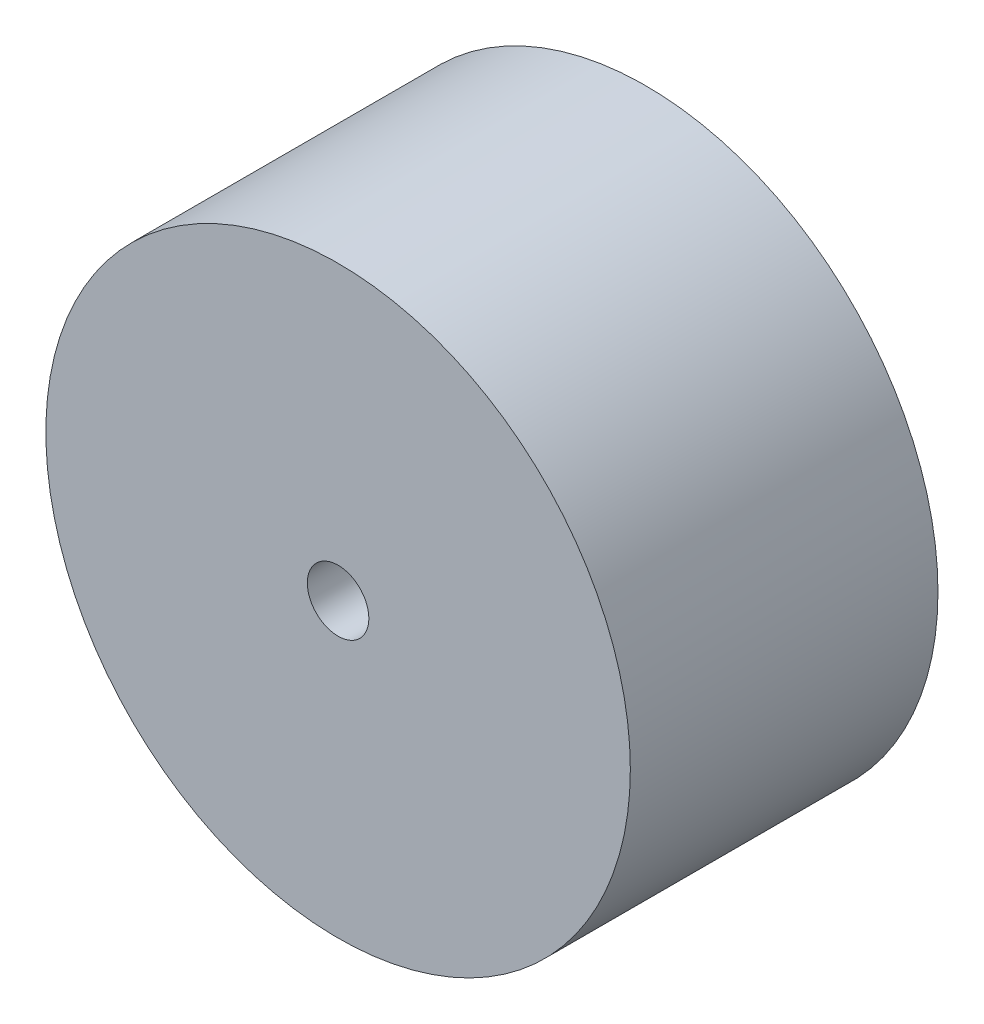
ISO-10303-21;
HEADER;
FILE_DESCRIPTION(('STEP AP214'),'2;1');
FILE_NAME('part.step','',(''),(''),'','','');
FILE_SCHEMA(('AUTOMOTIVE_DESIGN { 1 0 10303 214 1 1 1 1 }'));
ENDSEC;
DATA;
#1=APPLICATION_CONTEXT('core data for automotive mechanical design processes');
#2=APPLICATION_PROTOCOL_DEFINITION('international standard','automotive_design',2000,#1);
#3=PRODUCT_CONTEXT('',#1,'mechanical');
#4=PRODUCT('Part','Part','',(#3));
#5=PRODUCT_RELATED_PRODUCT_CATEGORY('part','',(#4));
#6=PRODUCT_DEFINITION_FORMATION('','',#4);
#7=PRODUCT_DEFINITION_CONTEXT('part definition',#1,'design');
#8=PRODUCT_DEFINITION('design','',#6,#7);
#9=PRODUCT_DEFINITION_SHAPE('','',#8);
#10=(LENGTH_UNIT() NAMED_UNIT(*) SI_UNIT(.MILLI.,.METRE.));
#11=(NAMED_UNIT(*) PLANE_ANGLE_UNIT() SI_UNIT($,.RADIAN.));
#12=(NAMED_UNIT(*) SI_UNIT($,.STERADIAN.) SOLID_ANGLE_UNIT());
#13=UNCERTAINTY_MEASURE_WITH_UNIT(LENGTH_MEASURE(1.E-05),#10,'distance_accuracy_value','');
#14=(GEOMETRIC_REPRESENTATION_CONTEXT(3) GLOBAL_UNCERTAINTY_ASSIGNED_CONTEXT((#13)) GLOBAL_UNIT_ASSIGNED_CONTEXT((#10,
#11,#12)) REPRESENTATION_CONTEXT('',''));
#15=CARTESIAN_POINT('',(0.,0.,0.));
#16=DIRECTION('',(0.,0.,1.));
#17=DIRECTION('',(1.,0.,0.));
#18=AXIS2_PLACEMENT_3D('',#15,#16,#17);
#19=CARTESIAN_POINT('',(-12.6941203703704,1.2144375,30.));
#20=DIRECTION('',(0.,0.,-1.));
#21=DIRECTION('',(-1.,0.,0.));
#22=AXIS2_PLACEMENT_3D('',#19,#20,#21);
#23=CYLINDRICAL_SURFACE('',#22,28.5);
#24=CARTESIAN_POINT('',(-12.6941203703704,1.2144375,30.));
#25=DIRECTION('',(0.,0.,1.));
#26=DIRECTION('',(1.,0.,0.));
#27=AXIS2_PLACEMENT_3D('',#24,#25,#26);
#28=CIRCLE('',#27,28.5);
#29=CARTESIAN_POINT('',(15.8058796296296,1.2144375,30.));
#30=VERTEX_POINT('',#29);
#31=EDGE_CURVE('E10',#30,#30,#28,.T.);
#32=ORIENTED_EDGE('',*,*,#31,.F.);
#33=EDGE_LOOP('',(#32));
#34=FACE_BOUND('',#33,.T.);
#35=CARTESIAN_POINT('',(-12.6941203703704,1.2144375,0.));
#36=DIRECTION('',(0.,0.,1.));
#37=DIRECTION('',(1.,0.,0.));
#38=AXIS2_PLACEMENT_3D('',#35,#36,#37);
#39=CIRCLE('',#38,28.5);
#40=CARTESIAN_POINT('',(15.8058796296296,1.2144375,0.));
#41=VERTEX_POINT('',#40);
#42=EDGE_CURVE('E37',#41,#41,#39,.T.);
#43=ORIENTED_EDGE('',*,*,#42,.T.);
#44=EDGE_LOOP('',(#43));
#45=FACE_BOUND('',#44,.T.);
#46=ADVANCED_FACE('F30',(#34,#45),#23,.T.);
#47=CARTESIAN_POINT('',(-12.6941203703704,1.2144375,30.));
#48=DIRECTION('',(0.,0.,1.));
#49=DIRECTION('',(1.,0.,0.));
#50=AXIS2_PLACEMENT_3D('',#47,#48,#49);
#51=PLANE('',#50);
#52=CARTESIAN_POINT('',(-12.6941203703704,1.2144375,30.));
#53=DIRECTION('',(0.,0.,1.));
#54=DIRECTION('',(1.,0.,0.));
#55=AXIS2_PLACEMENT_3D('',#52,#53,#54);
#56=CIRCLE('',#55,3.);
#57=CARTESIAN_POINT('',(-9.69412037037038,1.2144375,30.));
#58=VERTEX_POINT('',#57);
#59=EDGE_CURVE('E43',#58,#58,#56,.T.);
#60=ORIENTED_EDGE('',*,*,#59,.F.);
#61=EDGE_LOOP('',(#60));
#62=FACE_BOUND('',#61,.T.);
#63=ORIENTED_EDGE('',*,*,#31,.T.);
#64=EDGE_LOOP('',(#63));
#65=FACE_BOUND('',#64,.T.);
#66=ADVANCED_FACE('F59',(#62,#65),#51,.T.);
#67=CARTESIAN_POINT('',(-12.6941203703704,1.2144375,0.));
#68=DIRECTION('',(0.,0.,1.));
#69=DIRECTION('',(1.,0.,0.));
#70=AXIS2_PLACEMENT_3D('',#67,#68,#69);
#71=PLANE('',#70);
#72=CARTESIAN_POINT('',(-12.6941203703704,1.2144375,0.));
#73=DIRECTION('',(0.,0.,1.));
#74=DIRECTION('',(1.,0.,0.));
#75=AXIS2_PLACEMENT_3D('',#72,#73,#74);
#76=CIRCLE('',#75,3.);
#77=CARTESIAN_POINT('',(-9.69412037037038,1.2144375,0.));
#78=VERTEX_POINT('',#77);
#79=EDGE_CURVE('E33',#78,#78,#76,.T.);
#80=ORIENTED_EDGE('',*,*,#79,.T.);
#81=EDGE_LOOP('',(#80));
#82=FACE_BOUND('',#81,.T.);
#83=ORIENTED_EDGE('',*,*,#42,.F.);
#84=EDGE_LOOP('',(#83));
#85=FACE_BOUND('',#84,.T.);
#86=ADVANCED_FACE('F50',(#82,#85),#71,.F.);
#87=CARTESIAN_POINT('',(-12.6941203703704,1.2144375,-10.));
#88=DIRECTION('',(0.,0.,1.));
#89=DIRECTION('',(1.,0.,0.));
#90=AXIS2_PLACEMENT_3D('',#87,#88,#89);
#91=CYLINDRICAL_SURFACE('',#90,3.);
#92=ORIENTED_EDGE('',*,*,#59,.T.);
#93=EDGE_LOOP('',(#92));
#94=FACE_BOUND('',#93,.T.);
#95=ORIENTED_EDGE('',*,*,#79,.F.);
#96=EDGE_LOOP('',(#95));
#97=FACE_BOUND('',#96,.T.);
#98=ADVANCED_FACE('F53',(#94,#97),#91,.F.);
#99=CLOSED_SHELL('',(#46,#66,#86,#98));
#100=MANIFOLD_SOLID_BREP('B2',#99);
#101=ADVANCED_BREP_SHAPE_REPRESENTATION('',(#18,#100),#14);
#102=SHAPE_DEFINITION_REPRESENTATION(#9,#101);
ENDSEC;
END-ISO-10303-21;
